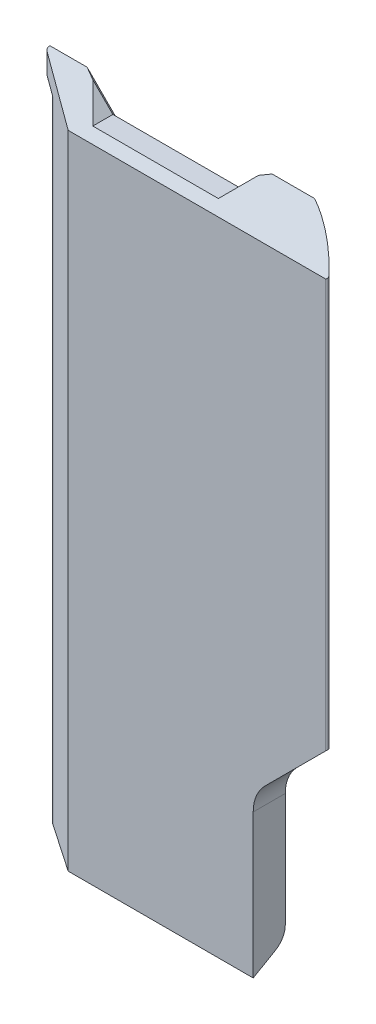
ISO-10303-21;
HEADER;
FILE_DESCRIPTION(('STEP AP214'),'2;1');
FILE_NAME('part.step','',(''),(''),'','','');
FILE_SCHEMA(('AUTOMOTIVE_DESIGN { 1 0 10303 214 1 1 1 1 }'));
ENDSEC;
DATA;
#1=APPLICATION_CONTEXT('core data for automotive mechanical design processes');
#2=APPLICATION_PROTOCOL_DEFINITION('international standard','automotive_design',2000,#1);
#3=PRODUCT_CONTEXT('',#1,'mechanical');
#4=PRODUCT('Part','Part','',(#3));
#5=PRODUCT_RELATED_PRODUCT_CATEGORY('part','',(#4));
#6=PRODUCT_DEFINITION_FORMATION('','',#4);
#7=PRODUCT_DEFINITION_CONTEXT('part definition',#1,'design');
#8=PRODUCT_DEFINITION('design','',#6,#7);
#9=PRODUCT_DEFINITION_SHAPE('','',#8);
#10=(LENGTH_UNIT() NAMED_UNIT(*) SI_UNIT(.MILLI.,.METRE.));
#11=(NAMED_UNIT(*) PLANE_ANGLE_UNIT() SI_UNIT($,.RADIAN.));
#12=(NAMED_UNIT(*) SI_UNIT($,.STERADIAN.) SOLID_ANGLE_UNIT());
#13=UNCERTAINTY_MEASURE_WITH_UNIT(LENGTH_MEASURE(1.E-05),#10,'distance_accuracy_value','');
#14=(GEOMETRIC_REPRESENTATION_CONTEXT(3) GLOBAL_UNCERTAINTY_ASSIGNED_CONTEXT((#13)) GLOBAL_UNIT_ASSIGNED_CONTEXT((#10,
#11,#12)) REPRESENTATION_CONTEXT('',''));
#15=CARTESIAN_POINT('',(0.,0.,0.));
#16=DIRECTION('',(0.,0.,1.));
#17=DIRECTION('',(1.,0.,0.));
#18=AXIS2_PLACEMENT_3D('',#15,#16,#17);
#19=CARTESIAN_POINT('',(-12.4999999999999,0.,21.6506350946109));
#20=DIRECTION('',(-0.499999999999998,0.,0.86602540378444));
#21=DIRECTION('',(0.86602540378444,0.,0.499999999999998));
#22=AXIS2_PLACEMENT_3D('',#19,#20,#21);
#23=PLANE('',#22);
#24=DIRECTION('',(-0.774596669241484,0.447213595499958,-0.447213595499956));
#25=VECTOR('',#24,1.);
#26=CARTESIAN_POINT('',(9.09845356715727,49.8794919243113,34.1205080756887));
#27=LINE('',#26,#25);
#28=CARTESIAN_POINT('',(-36.1435935394489,76.,8.));
#29=VERTEX_POINT('',#28);
#30=CARTESIAN_POINT('',(-48.7071796769725,83.2535898384863,0.746410161513777));
#31=VERTEX_POINT('',#30);
#32=EDGE_CURVE('E302',#29,#31,#27,.T.);
#33=ORIENTED_EDGE('',*,*,#32,.T.);
#34=DIRECTION('',(0.,-1.,0.));
#35=VECTOR('',#34,1.);
#36=CARTESIAN_POINT('',(-48.7071796769725,0.,0.746410161513777));
#37=LINE('',#36,#35);
#38=CARTESIAN_POINT('',(-48.7071796769725,78.1656854249492,0.746410161513777));
#39=VERTEX_POINT('',#38);
#40=EDGE_CURVE('E410',#31,#39,#37,.T.);
#41=ORIENTED_EDGE('',*,*,#40,.T.);
#42=DIRECTION('',(0.774596669241485,-0.447213595499957,0.447213595499956));
#43=VECTOR('',#42,1.);
#44=CARTESIAN_POINT('',(7.33595177749724,45.8091683934817,33.1029271929813));
#45=LINE('',#44,#43);
#46=CARTESIAN_POINT('',(-45.2430780618347,76.1656854249492,2.74641016151378));
#47=VERTEX_POINT('',#46);
#48=EDGE_CURVE('E408',#39,#47,#45,.T.);
#49=ORIENTED_EDGE('',*,*,#48,.T.);
#50=DIRECTION('',(0.,-1.,0.));
#51=VECTOR('',#50,1.);
#52=CARTESIAN_POINT('',(-45.2430780618347,0.,2.74641016151378));
#53=LINE('',#52,#51);
#54=CARTESIAN_POINT('',(-45.2430780618347,-80.9668384925381,2.74641016151378));
#55=VERTEX_POINT('',#54);
#56=EDGE_CURVE('E406',#47,#55,#53,.T.);
#57=ORIENTED_EDGE('',*,*,#56,.T.);
#58=DIRECTION('',(0.832050294337845,-0.277350098112614,0.480384461415259));
#59=VECTOR('',#58,1.);
#60=CARTESIAN_POINT('',(-33.7033533491883,-84.8134133967535,9.40887333073431));
#61=LINE('',#60,#59);
#62=CARTESIAN_POINT('',(-36.1435935394489,-84.,8.));
#63=VERTEX_POINT('',#62);
#64=EDGE_CURVE('E287',#55,#63,#61,.T.);
#65=ORIENTED_EDGE('',*,*,#64,.T.);
#66=DIRECTION('',(0.,1.,0.));
#67=VECTOR('',#66,1.);
#68=CARTESIAN_POINT('',(-36.1435935394489,0.,8.));
#69=LINE('',#68,#67);
#70=EDGE_CURVE('E295',#63,#29,#69,.T.);
#71=ORIENTED_EDGE('',*,*,#70,.T.);
#72=EDGE_LOOP('',(#33,#41,#49,#57,#65,#71));
#73=FACE_BOUND('',#72,.T.);
#74=ADVANCED_FACE('F39',(#73),#23,.T.);
#75=CARTESIAN_POINT('',(0.,0.,0.));
#76=DIRECTION('',(0.,0.,-1.));
#77=DIRECTION('',(-1.,0.,0.));
#78=AXIS2_PLACEMENT_3D('',#75,#76,#77);
#79=PLANE('',#78);
#80=DIRECTION('',(-1.,0.,0.));
#81=VECTOR('',#80,1.);
#82=CARTESIAN_POINT('',(-50.,78.,0.));
#83=LINE('',#82,#81);
#84=CARTESIAN_POINT('',(-41.8994949366117,78.,0.));
#85=VERTEX_POINT('',#84);
#86=CARTESIAN_POINT('',(-48.5071796769725,78.,0.));
#87=VERTEX_POINT('',#86);
#88=EDGE_CURVE('E374',#85,#87,#83,.T.);
#89=ORIENTED_EDGE('',*,*,#88,.T.);
#90=DIRECTION('',(0.,-1.,0.));
#91=VECTOR('',#90,1.);
#92=CARTESIAN_POINT('',(-48.5071796769725,0.,0.));
#93=LINE('',#92,#91);
#94=CARTESIAN_POINT('',(-48.5071796769725,84.,0.));
#95=VERTEX_POINT('',#94);
#96=EDGE_CURVE('E416',#87,#95,#93,.F.);
#97=ORIENTED_EDGE('',*,*,#96,.T.);
#98=DIRECTION('',(-1.,0.,0.));
#99=VECTOR('',#98,1.);
#100=CARTESIAN_POINT('',(-50.,84.,0.));
#101=LINE('',#100,#99);
#102=CARTESIAN_POINT('',(-39.4142135623731,84.,0.));
#103=VERTEX_POINT('',#102);
#104=EDGE_CURVE('E298',#103,#95,#101,.T.);
#105=ORIENTED_EDGE('',*,*,#104,.F.);
#106=DIRECTION('',(0.707106781186545,-0.70710678118655,0.));
#107=VECTOR('',#106,1.);
#108=CARTESIAN_POINT('',(-32.7071067811866,77.2928932188134,0.));
#109=LINE('',#108,#107);
#110=CARTESIAN_POINT('',(-32.4142135623731,77.,0.));
#111=VERTEX_POINT('',#110);
#112=EDGE_CURVE('E341',#103,#111,#109,.T.);
#113=ORIENTED_EDGE('',*,*,#112,.T.);
#114=DIRECTION('',(1.,0.,0.));
#115=VECTOR('',#114,1.);
#116=CARTESIAN_POINT('',(-0.69326392517994,77.,0.));
#117=LINE('',#116,#115);
#118=CARTESIAN_POINT('',(-0.279050362806846,77.,0.));
#119=VERTEX_POINT('',#118);
#120=EDGE_CURVE('E343',#111,#119,#117,.T.);
#121=ORIENTED_EDGE('',*,*,#120,.T.);
#122=DIRECTION('',(0.707106781186548,0.707106781186547,0.));
#123=VECTOR('',#122,1.);
#124=CARTESIAN_POINT('',(6.01384285600663,83.2928932188134,0.));
#125=LINE('',#124,#123);
#126=CARTESIAN_POINT('',(6.7209496371932,84.,0.));
#127=VERTEX_POINT('',#126);
#128=EDGE_CURVE('E345',#119,#127,#125,.T.);
#129=ORIENTED_EDGE('',*,*,#128,.T.);
#130=CARTESIAN_POINT('',(17.3067360748201,84.,0.));
#131=VERTEX_POINT('',#130);
#132=EDGE_CURVE('E303',#131,#127,#101,.T.);
#133=ORIENTED_EDGE('',*,*,#132,.F.);
#134=DIRECTION('',(0.,-1.,0.));
#135=VECTOR('',#134,1.);
#136=CARTESIAN_POINT('',(17.3067360748201,114.,0.));
#137=LINE('',#136,#135);
#138=CARTESIAN_POINT('',(17.3067360748201,-36.6932639251798,0.));
#139=VERTEX_POINT('',#138);
#140=EDGE_CURVE('E289',#131,#139,#137,.T.);
#141=ORIENTED_EDGE('',*,*,#140,.T.);
#142=DIRECTION('',(0.707106781186544,0.707106781186551,0.));
#143=VECTOR('',#142,1.);
#144=CARTESIAN_POINT('',(60.,6.00000000000048,0.));
#145=LINE('',#144,#143);
#146=CARTESIAN_POINT('',(12.9289321881345,-41.0710678118655,0.));
#147=VERTEX_POINT('',#146);
#148=EDGE_CURVE('E276',#147,#139,#145,.T.);
#149=ORIENTED_EDGE('',*,*,#148,.F.);
#150=CARTESIAN_POINT('',(20.,-48.1421356237309,0.));
#151=DIRECTION('',(0.,0.,-1.));
#152=DIRECTION('',(-1.,0.,0.));
#153=AXIS2_PLACEMENT_3D('',#150,#151,#152);
#154=CIRCLE('',#153,10.);
#155=CARTESIAN_POINT('',(9.99999999999999,-48.1421356237309,0.));
#156=VERTEX_POINT('',#155);
#157=EDGE_CURVE('E326',#147,#156,#154,.F.);
#158=ORIENTED_EDGE('',*,*,#157,.T.);
#159=DIRECTION('',(0.,1.,0.));
#160=VECTOR('',#159,1.);
#161=CARTESIAN_POINT('',(9.99999999999999,-44.,0.));
#162=LINE('',#161,#160);
#163=CARTESIAN_POINT('',(9.99999999999999,-76.4944465005349,0.));
#164=VERTEX_POINT('',#163);
#165=EDGE_CURVE('E269',#164,#156,#162,.T.);
#166=ORIENTED_EDGE('',*,*,#165,.F.);
#167=DIRECTION('',(-1.,0.,0.));
#168=VECTOR('',#167,1.);
#169=CARTESIAN_POINT('',(0.,-76.4944465005349,0.));
#170=LINE('',#169,#168);
#171=CARTESIAN_POINT('',(-34.,-76.4944465005349,0.));
#172=VERTEX_POINT('',#171);
#173=EDGE_CURVE('E311',#164,#172,#170,.T.);
#174=ORIENTED_EDGE('',*,*,#173,.T.);
#175=DIRECTION('',(0.,-1.,0.));
#176=VECTOR('',#175,1.);
#177=CARTESIAN_POINT('',(-34.,0.,0.));
#178=LINE('',#177,#176);
#179=CARTESIAN_POINT('',(-34.,-68.4944465005349,0.));
#180=VERTEX_POINT('',#179);
#181=EDGE_CURVE('E232',#180,#172,#178,.T.);
#182=ORIENTED_EDGE('',*,*,#181,.F.);
#183=DIRECTION('',(1.,0.,0.));
#184=VECTOR('',#183,1.);
#185=CARTESIAN_POINT('',(0.,-68.4944465005349,0.));
#186=LINE('',#185,#184);
#187=CARTESIAN_POINT('',(-1.00000000000008,-68.4944465005349,0.));
#188=VERTEX_POINT('',#187);
#189=EDGE_CURVE('E377',#180,#188,#186,.T.);
#190=ORIENTED_EDGE('',*,*,#189,.T.);
#191=DIRECTION('',(0.,1.,0.));
#192=VECTOR('',#191,1.);
#193=CARTESIAN_POINT('',(-1.00000000000001,-13.801182575355,0.));
#194=LINE('',#193,#192);
#195=CARTESIAN_POINT('',(-1.00000000000001,-14.6296097001012,0.));
#196=VERTEX_POINT('',#195);
#197=EDGE_CURVE('E363',#188,#196,#194,.T.);
#198=ORIENTED_EDGE('',*,*,#197,.T.);
#199=DIRECTION('',(0.707106781186549,0.707106781186546,0.));
#200=VECTOR('',#199,1.);
#201=CARTESIAN_POINT('',(5.72094963719316,-7.90866006290804,0.));
#202=LINE('',#201,#200);
#203=CARTESIAN_POINT('',(6.30673607482006,-7.32287362528113,0.));
#204=VERTEX_POINT('',#203);
#205=EDGE_CURVE('E238',#196,#204,#202,.T.);
#206=ORIENTED_EDGE('',*,*,#205,.T.);
#207=DIRECTION('',(0.,1.,0.));
#208=VECTOR('',#207,1.);
#209=CARTESIAN_POINT('',(6.30673607482007,58.5055534994651,0.));
#210=LINE('',#209,#208);
#211=CARTESIAN_POINT('',(6.30673607482007,59.3339806242113,0.));
#212=VERTEX_POINT('',#211);
#213=EDGE_CURVE('E366',#204,#212,#210,.T.);
#214=ORIENTED_EDGE('',*,*,#213,.T.);
#215=DIRECTION('',(-0.707106781186547,0.707106781186548,0.));
#216=VECTOR('',#215,1.);
#217=CARTESIAN_POINT('',(32.8203583495157,32.8203583495157,0.));
#218=LINE('',#217,#216);
#219=CARTESIAN_POINT('',(-4.86483680043379,70.5055534994652,0.));
#220=VERTEX_POINT('',#219);
#221=EDGE_CURVE('E368',#212,#220,#218,.T.);
#222=ORIENTED_EDGE('',*,*,#221,.T.);
#223=DIRECTION('',(-1.,0.,0.));
#224=VECTOR('',#223,1.);
#225=CARTESIAN_POINT('',(-35.233475560823,70.5055534994652,0.));
#226=LINE('',#225,#224);
#227=CARTESIAN_POINT('',(-34.4050484360768,70.5055534994652,0.));
#228=VERTEX_POINT('',#227);
#229=EDGE_CURVE('E370',#220,#228,#226,.T.);
#230=ORIENTED_EDGE('',*,*,#229,.T.);
#231=DIRECTION('',(-0.707106781186548,0.707106781186548,0.));
#232=VECTOR('',#231,1.);
#233=CARTESIAN_POINT('',(-41.3137084989847,77.4142135623731,0.));
#234=LINE('',#233,#232);
#235=EDGE_CURVE('E372',#228,#85,#234,.T.);
#236=ORIENTED_EDGE('',*,*,#235,.T.);
#237=EDGE_LOOP('',(#89,#97,#105,#113,#121,#129,#133,#141,#149,#158,#166,#174,#182,#190,#198,
#206,#214,#222,#230,#236));
#238=FACE_BOUND('',#237,.T.);
#239=ADVANCED_FACE('F433',(#238),#79,.T.);
#240=CARTESIAN_POINT('',(6.53640646055106,114.,28.));
#241=DIRECTION('',(0.,-1.,0.));
#242=DIRECTION('',(0.,0.,-1.));
#243=AXIS2_PLACEMENT_3D('',#240,#241,#242);
#244=CYLINDRICAL_SURFACE('',#243,30.);
#245=CARTESIAN_POINT('',(6.53640646055106,56.,28.));
#246=DIRECTION('',(0.,0.707106781186546,0.707106781186549));
#247=DIRECTION('',(0.,-0.707106781186549,0.707106781186546));
#248=AXIS2_PLACEMENT_3D('',#245,#246,#247);
#249=ELLIPSE('',#248,42.4264068711929,30.);
#250=CARTESIAN_POINT('',(28.2738496256124,76.6756756756757,7.32432432432432));
#251=VERTEX_POINT('',#250);
#252=EDGE_CURVE('E308',#131,#251,#249,.F.);
#253=ORIENTED_EDGE('',*,*,#252,.T.);
#254=DIRECTION('',(0.,-1.,0.));
#255=VECTOR('',#254,1.);
#256=CARTESIAN_POINT('',(28.2738496256124,114.,7.32432432432432));
#257=LINE('',#256,#255);
#258=CARTESIAN_POINT('',(28.2738496256124,-25.7261503743874,7.32432432432432));
#259=VERTEX_POINT('',#258);
#260=EDGE_CURVE('E382',#251,#259,#257,.T.);
#261=ORIENTED_EDGE('',*,*,#260,.T.);
#262=CARTESIAN_POINT('',(6.53640646055106,-47.463593539449,28.));
#263=DIRECTION('',(-0.707106781186551,0.707106781186544,0.));
#264=DIRECTION('',(-0.707106781186544,-0.707106781186551,0.));
#265=AXIS2_PLACEMENT_3D('',#262,#263,#264);
#266=ELLIPSE('',#265,42.4264068711931,30.);
#267=EDGE_CURVE('E285',#259,#139,#266,.T.);
#268=ORIENTED_EDGE('',*,*,#267,.T.);
#269=ORIENTED_EDGE('',*,*,#140,.F.);
#270=EDGE_LOOP('',(#253,#261,#268,#269));
#271=FACE_BOUND('',#270,.T.);
#272=ADVANCED_FACE('F535',(#271),#244,.T.);
#273=CARTESIAN_POINT('',(0.,0.,8.));
#274=DIRECTION('',(0.,0.,-1.));
#275=DIRECTION('',(-1.,0.,0.));
#276=AXIS2_PLACEMENT_3D('',#273,#274,#275);
#277=PLANE('',#276);
#278=DIRECTION('',(0.707106781186544,0.707106781186551,0.));
#279=VECTOR('',#278,1.);
#280=CARTESIAN_POINT('',(27.0000000000001,-26.9999999999998,8.));
#281=LINE('',#280,#279);
#282=CARTESIAN_POINT('',(12.9289321881345,-41.0710678118655,8.));
#283=VERTEX_POINT('',#282);
#284=CARTESIAN_POINT('',(27.9840170500783,-26.0159829499215,8.));
#285=VERTEX_POINT('',#284);
#286=EDGE_CURVE('E318',#283,#285,#281,.T.);
#287=ORIENTED_EDGE('',*,*,#286,.T.);
#288=DIRECTION('',(0.,-1.,0.));
#289=VECTOR('',#288,1.);
#290=CARTESIAN_POINT('',(27.9840170500783,0.,8.));
#291=LINE('',#290,#289);
#292=CARTESIAN_POINT('',(27.9840170500783,76.,8.));
#293=VERTEX_POINT('',#292);
#294=EDGE_CURVE('E400',#285,#293,#291,.F.);
#295=ORIENTED_EDGE('',*,*,#294,.T.);
#296=DIRECTION('',(1.,0.,0.));
#297=VECTOR('',#296,1.);
#298=CARTESIAN_POINT('',(0.,76.,8.));
#299=LINE('',#298,#297);
#300=EDGE_CURVE('E292',#29,#293,#299,.T.);
#301=ORIENTED_EDGE('',*,*,#300,.F.);
#302=ORIENTED_EDGE('',*,*,#70,.F.);
#303=DIRECTION('',(1.,0.,0.));
#304=VECTOR('',#303,1.);
#305=CARTESIAN_POINT('',(-50.,-84.,8.));
#306=LINE('',#305,#304);
#307=CARTESIAN_POINT('',(9.99999999999999,-84.,8.00000000000004));
#308=VERTEX_POINT('',#307);
#309=EDGE_CURVE('E299',#63,#308,#306,.T.);
#310=ORIENTED_EDGE('',*,*,#309,.T.);
#311=DIRECTION('',(0.,1.,0.));
#312=VECTOR('',#311,1.);
#313=CARTESIAN_POINT('',(10.,0.,8.));
#314=LINE('',#313,#312);
#315=CARTESIAN_POINT('',(9.99999999999999,-48.1421356237309,8.));
#316=VERTEX_POINT('',#315);
#317=EDGE_CURVE('E282',#308,#316,#314,.T.);
#318=ORIENTED_EDGE('',*,*,#317,.T.);
#319=CARTESIAN_POINT('',(20.,-48.1421356237309,8.));
#320=DIRECTION('',(0.,0.,-1.));
#321=DIRECTION('',(-1.,0.,0.));
#322=AXIS2_PLACEMENT_3D('',#319,#320,#321);
#323=CIRCLE('',#322,10.);
#324=EDGE_CURVE('E328',#316,#283,#323,.T.);
#325=ORIENTED_EDGE('',*,*,#324,.T.);
#326=EDGE_LOOP('',(#287,#295,#301,#302,#310,#318,#325));
#327=FACE_BOUND('',#326,.T.);
#328=ADVANCED_FACE('F540',(#327),#277,.F.);
#329=CARTESIAN_POINT('',(0.,41.9999999999999,42.));
#330=DIRECTION('',(0.,0.707106781186546,0.707106781186549));
#331=DIRECTION('',(0.,-0.707106781186549,0.707106781186546));
#332=AXIS2_PLACEMENT_3D('',#329,#330,#331);
#333=PLANE('',#332);
#334=ORIENTED_EDGE('',*,*,#300,.T.);
#335=CARTESIAN_POINT('',(27.9840170500783,76.4,7.6));
#336=DIRECTION('',(0.,0.707106781186546,0.707106781186549));
#337=DIRECTION('',(0.,-0.707106781186549,0.707106781186546));
#338=AXIS2_PLACEMENT_3D('',#335,#336,#337);
#339=ELLIPSE('',#338,0.565685424949239,0.4);
#340=EDGE_CURVE('E404',#293,#251,#339,.T.);
#341=ORIENTED_EDGE('',*,*,#340,.T.);
#342=ORIENTED_EDGE('',*,*,#252,.F.);
#343=ORIENTED_EDGE('',*,*,#132,.T.);
#344=DIRECTION('',(-0.862856209461017,-0.357406744336594,0.357406744336593));
#345=VECTOR('',#344,1.);
#346=CARTESIAN_POINT('',(-24.1877502271688,71.1971973208618,12.8028026791382));
#347=LINE('',#346,#345);
#348=CARTESIAN_POINT('',(4.3067360748201,83.,1.00000000000003));
#349=VERTEX_POINT('',#348);
#350=EDGE_CURVE('E349',#127,#349,#347,.T.);
#351=ORIENTED_EDGE('',*,*,#350,.T.);
#352=DIRECTION('',(0.577350269189627,0.577350269189626,-0.577350269189624));
#353=VECTOR('',#352,1.);
#354=CARTESIAN_POINT('',(-24.46217595012,54.2310879750599,29.76891202494));
#355=LINE('',#354,#353);
#356=CARTESIAN_POINT('',(-0.693263925179946,78.,6.00000000000005));
#357=VERTEX_POINT('',#356);
#358=EDGE_CURVE('E330',#357,#349,#355,.T.);
#359=ORIENTED_EDGE('',*,*,#358,.F.);
#360=DIRECTION('',(1.,0.,0.));
#361=VECTOR('',#360,1.);
#362=CARTESIAN_POINT('',(0.,78.,6.00000000000004));
#363=LINE('',#362,#361);
#364=CARTESIAN_POINT('',(-32.,78.,6.00000000000004));
#365=VERTEX_POINT('',#364);
#366=EDGE_CURVE('E333',#365,#357,#363,.T.);
#367=ORIENTED_EDGE('',*,*,#366,.F.);
#368=DIRECTION('',(0.577350269189624,-0.577350269189628,0.577350269189626));
#369=VECTOR('',#368,1.);
#370=CARTESIAN_POINT('',(2.66666666666655,43.3333333333332,40.6666666666668));
#371=LINE('',#370,#369);
#372=CARTESIAN_POINT('',(-37.,83.,1.00000000000003));
#373=VERTEX_POINT('',#372);
#374=EDGE_CURVE('E336',#373,#365,#371,.T.);
#375=ORIENTED_EDGE('',*,*,#374,.F.);
#376=DIRECTION('',(-0.862856209461016,0.357406744336595,-0.357406744336594));
#377=VECTOR('',#376,1.);
#378=CARTESIAN_POINT('',(15.8353025632353,61.1149011062219,22.8850988937781));
#379=LINE('',#378,#377);
#380=EDGE_CURVE('E347',#373,#103,#379,.T.);
#381=ORIENTED_EDGE('',*,*,#380,.T.);
#382=ORIENTED_EDGE('',*,*,#104,.T.);
#383=CARTESIAN_POINT('',(-48.5071796769725,83.6000000000001,0.400000000000001));
#384=DIRECTION('',(0.,0.707106781186546,0.707106781186549));
#385=DIRECTION('',(0.,-0.707106781186549,0.707106781186546));
#386=AXIS2_PLACEMENT_3D('',#383,#384,#385);
#387=ELLIPSE('',#386,0.565685424949239,0.4);
#388=EDGE_CURVE('E402',#95,#31,#387,.T.);
#389=ORIENTED_EDGE('',*,*,#388,.T.);
#390=ORIENTED_EDGE('',*,*,#32,.F.);
#391=EDGE_LOOP('',(#334,#341,#342,#343,#351,#359,#367,#375,#381,#382,#389,#390));
#392=FACE_BOUND('',#391,.T.);
#393=ADVANCED_FACE('F538',(#392),#333,.T.);
#394=CARTESIAN_POINT('',(0.,-59.5358983848622,-34.3730669589465));
#395=DIRECTION('',(0.,-0.866025403784438,-0.500000000000001));
#396=DIRECTION('',(0.,0.500000000000001,-0.866025403784438));
#397=AXIS2_PLACEMENT_3D('',#394,#395,#396);
#398=PLANE('',#397);
#399=ORIENTED_EDGE('',*,*,#64,.F.);
#400=CARTESIAN_POINT('',(-45.0430780618347,-80.7668384925381,2.4));
#401=DIRECTION('',(0.,-0.866025403784438,-0.500000000000001));
#402=DIRECTION('',(0.,-0.500000000000001,0.866025403784438));
#403=AXIS2_PLACEMENT_3D('',#400,#401,#402);
#404=ELLIPSE('',#403,0.461880215351701,0.4);
#405=CARTESIAN_POINT('',(-45.4303763964554,-80.824573519457,2.5));
#406=VERTEX_POINT('',#405);
#407=EDGE_CURVE('E418',#55,#406,#404,.T.);
#408=ORIENTED_EDGE('',*,*,#407,.T.);
#409=DIRECTION('',(-1.,0.,0.));
#410=VECTOR('',#409,1.);
#411=CARTESIAN_POINT('',(0.,-80.824573519457,2.5));
#412=LINE('',#411,#410);
#413=CARTESIAN_POINT('',(9.99999999999999,-80.824573519457,2.5));
#414=VERTEX_POINT('',#413);
#415=EDGE_CURVE('E314',#406,#414,#412,.F.);
#416=ORIENTED_EDGE('',*,*,#415,.T.);
#417=DIRECTION('',(0.,0.500000000000001,-0.866025403784438));
#418=VECTOR('',#417,1.);
#419=CARTESIAN_POINT('',(9.99999999999999,-59.5358983848622,-34.3730669589465));
#420=LINE('',#419,#418);
#421=EDGE_CURVE('E279',#308,#414,#420,.T.);
#422=ORIENTED_EDGE('',*,*,#421,.F.);
#423=ORIENTED_EDGE('',*,*,#309,.F.);
#424=EDGE_LOOP('',(#399,#408,#416,#422,#423));
#425=FACE_BOUND('',#424,.T.);
#426=ADVANCED_FACE('F432',(#425),#398,.T.);
#427=CARTESIAN_POINT('',(0.,-76.4944465005349,5.));
#428=DIRECTION('',(-1.,0.,0.));
#429=DIRECTION('',(0.,0.,1.));
#430=AXIS2_PLACEMENT_3D('',#427,#428,#429);
#431=CYLINDRICAL_SURFACE('',#430,5.);
#432=ORIENTED_EDGE('',*,*,#415,.F.);
#433=CARTESIAN_POINT('',(-45.4303763964554,-80.824573519457,2.5));
#434=CARTESIAN_POINT('',(-45.4378427211251,-80.807885335445,2.47105946234303));
#435=CARTESIAN_POINT('',(-45.4419723624522,-80.7905322558136,2.44170671072575));
#436=CARTESIAN_POINT('',(-45.4437938797185,-80.7551766158567,2.38326649098226));
#437=CARTESIAN_POINT('',(-45.4414990678816,-80.737175474733,2.35417859940898));
#438=CARTESIAN_POINT('',(-45.4313478450425,-80.7031780215346,2.30046578819398));
#439=CARTESIAN_POINT('',(-45.424153192839,-80.687186383771,2.27570937540224));
#440=CARTESIAN_POINT('',(-45.4050136575968,-80.6556317368514,2.22775216018819));
#441=CARTESIAN_POINT('',(-45.3930639843171,-80.6400691769084,2.20455295413454));
#442=CARTESIAN_POINT('',(-45.3642830206514,-80.6097666032676,2.16012766005666));
#443=CARTESIAN_POINT('',(-45.3473834832801,-80.5950417817653,2.13893504584978));
#444=CARTESIAN_POINT('',(-45.3088881395701,-80.5674880811874,2.09984455742066));
#445=CARTESIAN_POINT('',(-45.2873037212084,-80.5546547291808,2.08193888479921));
#446=CARTESIAN_POINT('',(-45.2475883364507,-80.5356430481617,2.05569995130867));
#447=CARTESIAN_POINT('',(-45.2306381742387,-80.5286611239552,2.04615156556742));
#448=CARTESIAN_POINT('',(-45.1950487665225,-80.5163961896203,2.02947364938593));
#449=CARTESIAN_POINT('',(-45.1764137719415,-80.5111090487987,2.02233823544102));
#450=CARTESIAN_POINT('',(-45.1389826870595,-80.5028344749713,2.01120855683318));
#451=CARTESIAN_POINT('',(-45.1202608817061,-80.4997298263376,2.00705388861777));
#452=CARTESIAN_POINT('',(-45.0820677271006,-80.4955160796758,2.00142601721193));
#453=CARTESIAN_POINT('',(-45.0625919976933,-80.4944213156715,1.99997207409895));
#454=CARTESIAN_POINT('',(-45.0430780618347,-80.4944465005349,2.));
#455=B_SPLINE_CURVE_WITH_KNOTS('',3,(#433,#434,#435,#436,#437,#438,#439,#440,#441,#442,#443,
#444,#445,#446,#447,#448,#449,#450,#451,#452,#453,#454),.UNSPECIFIED.,.F.,.F.,(4,2,2,2,2,2,2,2,
2,2,4),(0.,0.102455341503792,0.204698540696284,0.295321085586523,0.38603515632146,
0.478064100140838,0.569871797127378,0.631640451922278,0.693257392711238,0.751241235259031,
0.809637022044175),.UNSPECIFIED.);
#456=CARTESIAN_POINT('',(-45.0430780618347,-80.4944465005349,2.));
#457=VERTEX_POINT('',#456);
#458=EDGE_CURVE('E64',#406,#457,#455,.T.);
#459=ORIENTED_EDGE('',*,*,#458,.T.);
#460=DIRECTION('',(-1.,0.,0.));
#461=VECTOR('',#460,1.);
#462=CARTESIAN_POINT('',(0.,-80.4944465005349,2.));
#463=LINE('',#462,#461);
#464=CARTESIAN_POINT('',(-34.,-80.4944465005349,2.));
#465=VERTEX_POINT('',#464);
#466=EDGE_CURVE('E355',#457,#465,#463,.F.);
#467=ORIENTED_EDGE('',*,*,#466,.T.);
#468=CARTESIAN_POINT('',(-34.,-76.4944465005349,5.));
#469=DIRECTION('',(1.,0.,0.));
#470=DIRECTION('',(0.,1.,0.));
#471=AXIS2_PLACEMENT_3D('',#468,#469,#470);
#472=CIRCLE('',#471,5.);
#473=EDGE_CURVE('E360',#172,#465,#472,.F.);
#474=ORIENTED_EDGE('',*,*,#473,.F.);
#475=ORIENTED_EDGE('',*,*,#173,.F.);
#476=CARTESIAN_POINT('',(9.99999999999999,-76.4944465005349,5.));
#477=DIRECTION('',(-1.,0.,0.));
#478=DIRECTION('',(0.,-1.,0.));
#479=AXIS2_PLACEMENT_3D('',#476,#477,#478);
#480=CIRCLE('',#479,5.);
#481=EDGE_CURVE('E316',#414,#164,#480,.F.);
#482=ORIENTED_EDGE('',*,*,#481,.F.);
#483=EDGE_LOOP('',(#432,#459,#467,#474,#475,#482));
#484=FACE_BOUND('',#483,.T.);
#485=ADVANCED_FACE('F426',(#484),#431,.T.);
#486=CARTESIAN_POINT('',(60.,6.00000000000048,20.));
#487=DIRECTION('',(-0.707106781186551,0.707106781186544,0.));
#488=DIRECTION('',(-0.707106781186544,-0.707106781186551,0.));
#489=AXIS2_PLACEMENT_3D('',#486,#487,#488);
#490=PLANE('',#489);
#491=ORIENTED_EDGE('',*,*,#267,.F.);
#492=CARTESIAN_POINT('',(27.9840170500783,-26.0159829499215,7.6));
#493=DIRECTION('',(-0.707106781186551,0.707106781186544,0.));
#494=DIRECTION('',(-0.707106781186544,-0.707106781186551,0.));
#495=AXIS2_PLACEMENT_3D('',#492,#493,#494);
#496=ELLIPSE('',#495,0.565685424949241,0.4);
#497=EDGE_CURVE('E398',#259,#285,#496,.F.);
#498=ORIENTED_EDGE('',*,*,#497,.T.);
#499=ORIENTED_EDGE('',*,*,#286,.F.);
#500=DIRECTION('',(0.,0.,-1.));
#501=VECTOR('',#500,1.);
#502=CARTESIAN_POINT('',(12.9289321881345,-41.0710678118655,0.));
#503=LINE('',#502,#501);
#504=EDGE_CURVE('E321',#283,#147,#503,.T.);
#505=ORIENTED_EDGE('',*,*,#504,.T.);
#506=ORIENTED_EDGE('',*,*,#148,.T.);
#507=EDGE_LOOP('',(#491,#498,#499,#505,#506));
#508=FACE_BOUND('',#507,.T.);
#509=ADVANCED_FACE('F431',(#508),#490,.F.);
#510=CARTESIAN_POINT('',(9.99999999999999,-44.,20.));
#511=DIRECTION('',(-1.,0.,0.));
#512=DIRECTION('',(0.,-1.,0.));
#513=AXIS2_PLACEMENT_3D('',#510,#511,#512);
#514=PLANE('',#513);
#515=ORIENTED_EDGE('',*,*,#165,.T.);
#516=DIRECTION('',(0.,0.,-1.));
#517=VECTOR('',#516,1.);
#518=CARTESIAN_POINT('',(9.99999999999999,-48.1421356237309,8.));
#519=LINE('',#518,#517);
#520=EDGE_CURVE('E324',#156,#316,#519,.F.);
#521=ORIENTED_EDGE('',*,*,#520,.T.);
#522=ORIENTED_EDGE('',*,*,#317,.F.);
#523=ORIENTED_EDGE('',*,*,#421,.T.);
#524=ORIENTED_EDGE('',*,*,#481,.T.);
#525=EDGE_LOOP('',(#515,#521,#522,#523,#524));
#526=FACE_BOUND('',#525,.T.);
#527=ADVANCED_FACE('F439',(#526),#514,.F.);
#528=CARTESIAN_POINT('',(20.,-48.1421356237309,20.));
#529=DIRECTION('',(0.,0.,1.));
#530=DIRECTION('',(1.,0.,0.));
#531=AXIS2_PLACEMENT_3D('',#528,#529,#530);
#532=CYLINDRICAL_SURFACE('',#531,10.);
#533=ORIENTED_EDGE('',*,*,#324,.F.);
#534=ORIENTED_EDGE('',*,*,#520,.F.);
#535=ORIENTED_EDGE('',*,*,#157,.F.);
#536=ORIENTED_EDGE('',*,*,#504,.F.);
#537=EDGE_LOOP('',(#533,#534,#535,#536));
#538=FACE_BOUND('',#537,.T.);
#539=ADVANCED_FACE('F435',(#538),#532,.F.);
#540=CARTESIAN_POINT('',(-32.,78.,10.));
#541=DIRECTION('',(-0.70710678118655,-0.707106781186545,0.));
#542=DIRECTION('',(0.707106781186545,-0.70710678118655,0.));
#543=AXIS2_PLACEMENT_3D('',#540,#541,#542);
#544=PLANE('',#543);
#545=DIRECTION('',(0.,0.,-1.));
#546=VECTOR('',#545,1.);
#547=CARTESIAN_POINT('',(-32.,78.,10.));
#548=LINE('',#547,#546);
#549=CARTESIAN_POINT('',(-32.,78.,1.00000000000003));
#550=VERTEX_POINT('',#549);
#551=EDGE_CURVE('E266',#365,#550,#548,.T.);
#552=ORIENTED_EDGE('',*,*,#551,.T.);
#553=DIRECTION('',(-0.707106781186545,0.70710678118655,0.));
#554=VECTOR('',#553,1.);
#555=CARTESIAN_POINT('',(-38.,84.,1.00000000000003));
#556=LINE('',#555,#554);
#557=EDGE_CURVE('E353',#550,#373,#556,.T.);
#558=ORIENTED_EDGE('',*,*,#557,.T.);
#559=ORIENTED_EDGE('',*,*,#374,.T.);
#560=EDGE_LOOP('',(#552,#558,#559));
#561=FACE_BOUND('',#560,.T.);
#562=ADVANCED_FACE('F438',(#561),#544,.F.);
#563=CARTESIAN_POINT('',(-0.69326392517994,78.,10.));
#564=DIRECTION('',(0.,-1.,0.));
#565=DIRECTION('',(0.,0.,-1.));
#566=AXIS2_PLACEMENT_3D('',#563,#564,#565);
#567=PLANE('',#566);
#568=DIRECTION('',(0.,0.,-1.));
#569=VECTOR('',#568,1.);
#570=CARTESIAN_POINT('',(-0.69326392517994,78.,10.));
#571=LINE('',#570,#569);
#572=CARTESIAN_POINT('',(-0.69326392517994,78.,1.00000000000003));
#573=VERTEX_POINT('',#572);
#574=EDGE_CURVE('E270',#357,#573,#571,.T.);
#575=ORIENTED_EDGE('',*,*,#574,.T.);
#576=DIRECTION('',(-1.,0.,0.));
#577=VECTOR('',#576,1.);
#578=CARTESIAN_POINT('',(-32.,78.,1.00000000000003));
#579=LINE('',#578,#577);
#580=EDGE_CURVE('E351',#573,#550,#579,.T.);
#581=ORIENTED_EDGE('',*,*,#580,.T.);
#582=ORIENTED_EDGE('',*,*,#551,.F.);
#583=ORIENTED_EDGE('',*,*,#366,.T.);
#584=EDGE_LOOP('',(#575,#581,#582,#583));
#585=FACE_BOUND('',#584,.T.);
#586=ADVANCED_FACE('F569',(#585),#567,.F.);
#587=CARTESIAN_POINT('',(5.30673607482007,84.,10.));
#588=DIRECTION('',(0.707106781186547,-0.707106781186548,0.));
#589=DIRECTION('',(0.707106781186548,0.707106781186547,0.));
#590=AXIS2_PLACEMENT_3D('',#587,#588,#589);
#591=PLANE('',#590);
#592=ORIENTED_EDGE('',*,*,#358,.T.);
#593=DIRECTION('',(-0.707106781186548,-0.707106781186547,0.));
#594=VECTOR('',#593,1.);
#595=CARTESIAN_POINT('',(-0.69326392517994,78.,1.00000000000003));
#596=LINE('',#595,#594);
#597=EDGE_CURVE('E338',#349,#573,#596,.T.);
#598=ORIENTED_EDGE('',*,*,#597,.T.);
#599=ORIENTED_EDGE('',*,*,#574,.F.);
#600=EDGE_LOOP('',(#592,#598,#599));
#601=FACE_BOUND('',#600,.T.);
#602=ADVANCED_FACE('F463',(#601),#591,.F.);
#603=CARTESIAN_POINT('',(-32.,78.,1.00000000000003));
#604=DIRECTION('',(0.500000000000002,0.499999999999998,-0.707106781186548));
#605=DIRECTION('',(0.707106781186545,-0.70710678118655,0.));
#606=AXIS2_PLACEMENT_3D('',#603,#604,#605);
#607=PLANE('',#606);
#608=ORIENTED_EDGE('',*,*,#380,.F.);
#609=ORIENTED_EDGE('',*,*,#557,.F.);
#610=DIRECTION('',(-0.281084637714811,-0.678598344545854,-0.678598344545844));
#611=VECTOR('',#610,1.);
#612=CARTESIAN_POINT('',(-29.5264994399321,83.9715585986538,6.97155859865374));
#613=LINE('',#612,#611);
#614=EDGE_CURVE('E273',#111,#550,#613,.F.);
#615=ORIENTED_EDGE('',*,*,#614,.F.);
#616=ORIENTED_EDGE('',*,*,#112,.F.);
#617=EDGE_LOOP('',(#608,#609,#615,#616));
#618=FACE_BOUND('',#617,.T.);
#619=ADVANCED_FACE('F457',(#618),#607,.T.);
#620=CARTESIAN_POINT('',(-0.69326392517994,78.,1.00000000000003));
#621=DIRECTION('',(0.,0.707106781186543,-0.707106781186552));
#622=DIRECTION('',(1.,0.,0.));
#623=AXIS2_PLACEMENT_3D('',#620,#621,#622);
#624=PLANE('',#623);
#625=ORIENTED_EDGE('',*,*,#614,.T.);
#626=ORIENTED_EDGE('',*,*,#580,.F.);
#627=DIRECTION('',(0.281084637714807,-0.678598344545855,-0.678598344545845));
#628=VECTOR('',#627,1.);
#629=CARTESIAN_POINT('',(-1.36367390280759,79.618512860339,2.61851286033902));
#630=LINE('',#629,#628);
#631=EDGE_CURVE('E263',#119,#573,#630,.F.);
#632=ORIENTED_EDGE('',*,*,#631,.F.);
#633=ORIENTED_EDGE('',*,*,#120,.F.);
#634=EDGE_LOOP('',(#625,#626,#632,#633));
#635=FACE_BOUND('',#634,.T.);
#636=ADVANCED_FACE('F450',(#635),#624,.T.);
#637=CARTESIAN_POINT('',(5.30673607482007,84.,1.00000000000003));
#638=DIRECTION('',(-0.500000000000001,0.500000000000001,-0.707106781186546));
#639=DIRECTION('',(0.707106781186548,0.707106781186547,0.));
#640=AXIS2_PLACEMENT_3D('',#637,#638,#639);
#641=PLANE('',#640);
#642=ORIENTED_EDGE('',*,*,#350,.F.);
#643=ORIENTED_EDGE('',*,*,#128,.F.);
#644=ORIENTED_EDGE('',*,*,#631,.T.);
#645=ORIENTED_EDGE('',*,*,#597,.F.);
#646=EDGE_LOOP('',(#642,#643,#644,#645));
#647=FACE_BOUND('',#646,.T.);
#648=ADVANCED_FACE('F442',(#647),#641,.T.);
#649=CARTESIAN_POINT('',(-34.,0.,2.));
#650=DIRECTION('',(1.,0.,0.));
#651=DIRECTION('',(0.,1.,0.));
#652=AXIS2_PLACEMENT_3D('',#649,#650,#651);
#653=PLANE('',#652);
#654=DIRECTION('',(0.,-1.,0.));
#655=VECTOR('',#654,1.);
#656=CARTESIAN_POINT('',(-34.,0.,2.));
#657=LINE('',#656,#655);
#658=CARTESIAN_POINT('',(-34.,-66.4944465005349,2.));
#659=VERTEX_POINT('',#658);
#660=EDGE_CURVE('E248',#659,#465,#657,.T.);
#661=ORIENTED_EDGE('',*,*,#660,.F.);
#662=DIRECTION('',(0.,0.707106781186548,0.707106781186547));
#663=VECTOR('',#662,1.);
#664=CARTESIAN_POINT('',(-34.,-68.4944465005349,0.));
#665=LINE('',#664,#663);
#666=EDGE_CURVE('E380',#659,#180,#665,.F.);
#667=ORIENTED_EDGE('',*,*,#666,.T.);
#668=ORIENTED_EDGE('',*,*,#181,.T.);
#669=ORIENTED_EDGE('',*,*,#473,.T.);
#670=EDGE_LOOP('',(#661,#667,#668,#669));
#671=FACE_BOUND('',#670,.T.);
#672=ADVANCED_FACE('F449',(#671),#653,.F.);
#673=CARTESIAN_POINT('',(0.,0.,2.));
#674=DIRECTION('',(0.,0.,-1.));
#675=DIRECTION('',(-1.,0.,0.));
#676=AXIS2_PLACEMENT_3D('',#673,#674,#675);
#677=PLANE('',#676);
#678=ORIENTED_EDGE('',*,*,#466,.F.);
#679=DIRECTION('',(0.,-1.,0.));
#680=VECTOR('',#679,1.);
#681=CARTESIAN_POINT('',(-45.0430780618347,0.,2.));
#682=LINE('',#681,#680);
#683=CARTESIAN_POINT('',(-45.0430780618347,76.,2.));
#684=VERTEX_POINT('',#683);
#685=EDGE_CURVE('E49',#457,#684,#682,.F.);
#686=ORIENTED_EDGE('',*,*,#685,.T.);
#687=DIRECTION('',(1.,0.,0.));
#688=VECTOR('',#687,1.);
#689=CARTESIAN_POINT('',(0.,76.,2.));
#690=LINE('',#689,#688);
#691=CARTESIAN_POINT('',(-42.7279220613578,76.,2.));
#692=VERTEX_POINT('',#691);
#693=EDGE_CURVE('E253',#684,#692,#690,.T.);
#694=ORIENTED_EDGE('',*,*,#693,.T.);
#695=DIRECTION('',(0.707106781186548,-0.707106781186548,0.));
#696=VECTOR('',#695,1.);
#697=CARTESIAN_POINT('',(16.6360389693211,16.6360389693211,2.));
#698=LINE('',#697,#696);
#699=CARTESIAN_POINT('',(-35.233475560823,68.5055534994652,2.));
#700=VERTEX_POINT('',#699);
#701=EDGE_CURVE('E255',#692,#700,#698,.T.);
#702=ORIENTED_EDGE('',*,*,#701,.T.);
#703=DIRECTION('',(1.,0.,0.));
#704=VECTOR('',#703,1.);
#705=CARTESIAN_POINT('',(0.,68.5055534994652,2.));
#706=LINE('',#705,#704);
#707=CARTESIAN_POINT('',(-5.69326392518,68.5055534994652,2.));
#708=VERTEX_POINT('',#707);
#709=EDGE_CURVE('E257',#700,#708,#706,.T.);
#710=ORIENTED_EDGE('',*,*,#709,.T.);
#711=DIRECTION('',(-0.707106781186547,0.707106781186548,0.));
#712=VECTOR('',#711,1.);
#713=CARTESIAN_POINT('',(31.4061447871426,31.4061447871425,2.));
#714=LINE('',#713,#712);
#715=CARTESIAN_POINT('',(4.30673607482007,58.5055534994651,2.));
#716=VERTEX_POINT('',#715);
#717=EDGE_CURVE('E259',#716,#708,#714,.T.);
#718=ORIENTED_EDGE('',*,*,#717,.F.);
#719=DIRECTION('',(0.,-1.,0.));
#720=VECTOR('',#719,1.);
#721=CARTESIAN_POINT('',(4.30673607482006,0.,2.));
#722=LINE('',#721,#720);
#723=CARTESIAN_POINT('',(4.30673607482006,-6.49444650053493,2.));
#724=VERTEX_POINT('',#723);
#725=EDGE_CURVE('E228',#716,#724,#722,.T.);
#726=ORIENTED_EDGE('',*,*,#725,.T.);
#727=DIRECTION('',(-0.707106781186549,-0.707106781186546,0.));
#728=VECTOR('',#727,1.);
#729=CARTESIAN_POINT('',(5.40059128767749,-5.40059128767751,2.));
#730=LINE('',#729,#728);
#731=CARTESIAN_POINT('',(-3.00000000000001,-13.801182575355,2.));
#732=VERTEX_POINT('',#731);
#733=EDGE_CURVE('E221',#724,#732,#730,.T.);
#734=ORIENTED_EDGE('',*,*,#733,.T.);
#735=DIRECTION('',(0.,-1.,0.));
#736=VECTOR('',#735,1.);
#737=CARTESIAN_POINT('',(-2.99999999999999,0.,2.));
#738=LINE('',#737,#736);
#739=CARTESIAN_POINT('',(-3.00000000000002,-66.4944465005349,2.));
#740=VERTEX_POINT('',#739);
#741=EDGE_CURVE('E225',#732,#740,#738,.T.);
#742=ORIENTED_EDGE('',*,*,#741,.T.);
#743=DIRECTION('',(1.,0.,0.));
#744=VECTOR('',#743,1.);
#745=CARTESIAN_POINT('',(0.,-66.4944465005349,2.));
#746=LINE('',#745,#744);
#747=EDGE_CURVE('E246',#659,#740,#746,.T.);
#748=ORIENTED_EDGE('',*,*,#747,.F.);
#749=ORIENTED_EDGE('',*,*,#660,.T.);
#750=EDGE_LOOP('',(#678,#686,#694,#702,#710,#718,#726,#734,#742,#748,#749));
#751=FACE_BOUND('',#750,.T.);
#752=ADVANCED_FACE('F223',(#751),#677,.T.);
#753=CARTESIAN_POINT('',(0.,76.,2.));
#754=DIRECTION('',(0.,-0.707106781186547,-0.707106781186548));
#755=DIRECTION('',(-1.,0.,0.));
#756=AXIS2_PLACEMENT_3D('',#753,#754,#755);
#757=PLANE('',#756);
#758=DIRECTION('',(0.774596669241485,-0.447213595499957,0.447213595499956));
#759=VECTOR('',#758,1.);
#760=CARTESIAN_POINT('',(-18.0984001745221,60.326325681007,17.673674318993));
#761=LINE('',#760,#759);
#762=CARTESIAN_POINT('',(-45.1944648534492,75.970245917365,2.02975408263498));
#763=VERTEX_POINT('',#762);
#764=CARTESIAN_POINT('',(-48.658566468587,77.970245917365,0.0297540826349856));
#765=VERTEX_POINT('',#764);
#766=EDGE_CURVE('E57',#763,#765,#761,.F.);
#767=ORIENTED_EDGE('',*,*,#766,.T.);
#768=CARTESIAN_POINT('',(-48.5071796769725,77.6,0.400000000000001));
#769=DIRECTION('',(0.,-0.707106781186547,-0.707106781186548));
#770=DIRECTION('',(0.,-0.707106781186548,0.707106781186547));
#771=AXIS2_PLACEMENT_3D('',#768,#769,#770);
#772=ELLIPSE('',#771,0.565685424949238,0.4);
#773=EDGE_CURVE('E414',#765,#87,#772,.T.);
#774=ORIENTED_EDGE('',*,*,#773,.T.);
#775=ORIENTED_EDGE('',*,*,#88,.F.);
#776=DIRECTION('',(0.281084637714821,0.678598344545847,-0.678598344545847));
#777=VECTOR('',#776,1.);
#778=CARTESIAN_POINT('',(-39.3520498881382,84.1500763854248,-6.15007638542476));
#779=LINE('',#778,#777);
#780=EDGE_CURVE('E265',#692,#85,#779,.T.);
#781=ORIENTED_EDGE('',*,*,#780,.F.);
#782=ORIENTED_EDGE('',*,*,#693,.F.);
#783=CARTESIAN_POINT('',(-45.0430780618347,75.6,2.4));
#784=DIRECTION('',(0.,-0.707106781186547,-0.707106781186548));
#785=DIRECTION('',(0.,-0.707106781186548,0.707106781186547));
#786=AXIS2_PLACEMENT_3D('',#783,#784,#785);
#787=ELLIPSE('',#786,0.565685424949238,0.4);
#788=EDGE_CURVE('E11',#684,#763,#787,.F.);
#789=ORIENTED_EDGE('',*,*,#788,.T.);
#790=EDGE_LOOP('',(#767,#774,#775,#781,#782,#789));
#791=FACE_BOUND('',#790,.T.);
#792=ADVANCED_FACE('F510',(#791),#757,.T.);
#793=CARTESIAN_POINT('',(16.6360389693211,16.6360389693211,2.));
#794=DIRECTION('',(-0.5,-0.5,-0.707106781186548));
#795=DIRECTION('',(-0.707106781186548,0.707106781186548,0.));
#796=AXIS2_PLACEMENT_3D('',#793,#794,#795);
#797=PLANE('',#796);
#798=ORIENTED_EDGE('',*,*,#780,.T.);
#799=ORIENTED_EDGE('',*,*,#235,.F.);
#800=DIRECTION('',(0.281084637714821,0.678598344545847,-0.678598344545847));
#801=VECTOR('',#800,1.);
#802=CARTESIAN_POINT('',(-32.4497289152269,75.2261124054738,-4.72055890600869));
#803=LINE('',#802,#801);
#804=EDGE_CURVE('E391',#700,#228,#803,.T.);
#805=ORIENTED_EDGE('',*,*,#804,.F.);
#806=ORIENTED_EDGE('',*,*,#701,.F.);
#807=EDGE_LOOP('',(#798,#799,#805,#806));
#808=FACE_BOUND('',#807,.T.);
#809=ADVANCED_FACE('F504',(#808),#797,.T.);
#810=CARTESIAN_POINT('',(0.,68.5055534994652,2.));
#811=DIRECTION('',(0.,-0.707106781186547,-0.707106781186548));
#812=DIRECTION('',(-1.,0.,0.));
#813=AXIS2_PLACEMENT_3D('',#810,#811,#812);
#814=PLANE('',#813);
#815=ORIENTED_EDGE('',*,*,#804,.T.);
#816=ORIENTED_EDGE('',*,*,#229,.F.);
#817=DIRECTION('',(-0.281084637714823,-0.678598344545847,0.678598344545846));
#818=VECTOR('',#817,1.);
#819=CARTESIAN_POINT('',(-5.24344726355506,69.5915069845415,0.91404651492369));
#820=LINE('',#819,#818);
#821=EDGE_CURVE('E388',#708,#220,#820,.F.);
#822=ORIENTED_EDGE('',*,*,#821,.F.);
#823=ORIENTED_EDGE('',*,*,#709,.F.);
#824=EDGE_LOOP('',(#815,#816,#822,#823));
#825=FACE_BOUND('',#824,.T.);
#826=ADVANCED_FACE('F497',(#825),#814,.T.);
#827=CARTESIAN_POINT('',(32.8203583495157,32.8203583495157,0.));
#828=DIRECTION('',(0.499999999999999,0.499999999999999,0.707106781186549));
#829=DIRECTION('',(-0.707106781186547,0.707106781186548,0.));
#830=AXIS2_PLACEMENT_3D('',#827,#828,#829);
#831=PLANE('',#830);
#832=ORIENTED_EDGE('',*,*,#821,.T.);
#833=ORIENTED_EDGE('',*,*,#221,.F.);
#834=DIRECTION('',(-0.678598344545847,-0.281084637714823,0.678598344545846));
#835=VECTOR('',#834,1.);
#836=CARTESIAN_POINT('',(13.4588425124472,62.2964801102124,-7.1521064376271));
#837=LINE('',#836,#835);
#838=EDGE_CURVE('E385',#716,#212,#837,.F.);
#839=ORIENTED_EDGE('',*,*,#838,.F.);
#840=ORIENTED_EDGE('',*,*,#717,.T.);
#841=EDGE_LOOP('',(#832,#833,#839,#840));
#842=FACE_BOUND('',#841,.T.);
#843=ADVANCED_FACE('F490',(#842),#831,.F.);
#844=CARTESIAN_POINT('',(4.30673607482006,0.,2.));
#845=DIRECTION('',(-0.707106781186547,0.,-0.707106781186548));
#846=DIRECTION('',(0.,1.,0.));
#847=AXIS2_PLACEMENT_3D('',#844,#845,#846);
#848=PLANE('',#847);
#849=ORIENTED_EDGE('',*,*,#838,.T.);
#850=ORIENTED_EDGE('',*,*,#213,.F.);
#851=DIRECTION('',(0.678598344545847,-0.281084637714822,-0.678598344545846));
#852=VECTOR('',#851,1.);
#853=CARTESIAN_POINT('',(3.06796216523452,-5.98132954647066,3.23877390958554));
#854=LINE('',#853,#852);
#855=EDGE_CURVE('E241',#724,#204,#854,.T.);
#856=ORIENTED_EDGE('',*,*,#855,.F.);
#857=ORIENTED_EDGE('',*,*,#725,.F.);
#858=EDGE_LOOP('',(#849,#850,#856,#857));
#859=FACE_BOUND('',#858,.T.);
#860=ADVANCED_FACE('F484',(#859),#848,.T.);
#861=CARTESIAN_POINT('',(5.40059128767749,-5.40059128767751,2.));
#862=DIRECTION('',(-0.499999999999999,0.5,-0.707106781186548));
#863=DIRECTION('',(0.707106781186549,0.707106781186546,0.));
#864=AXIS2_PLACEMENT_3D('',#861,#862,#863);
#865=PLANE('',#864);
#866=ORIENTED_EDGE('',*,*,#855,.T.);
#867=ORIENTED_EDGE('',*,*,#205,.F.);
#868=DIRECTION('',(0.678598344545847,-0.281084637714823,-0.678598344545847));
#869=VECTOR('',#868,1.);
#870=CARTESIAN_POINT('',(-5.63248683230636,-12.7107708266451,4.63248683230635));
#871=LINE('',#870,#869);
#872=EDGE_CURVE('E236',#732,#196,#871,.T.);
#873=ORIENTED_EDGE('',*,*,#872,.F.);
#874=ORIENTED_EDGE('',*,*,#733,.F.);
#875=EDGE_LOOP('',(#866,#867,#873,#874));
#876=FACE_BOUND('',#875,.T.);
#877=ADVANCED_FACE('F237',(#876),#865,.T.);
#878=CARTESIAN_POINT('',(-2.99999999999999,0.,2.));
#879=DIRECTION('',(-0.707106781186547,0.,-0.707106781186548));
#880=DIRECTION('',(0.,1.,0.));
#881=AXIS2_PLACEMENT_3D('',#878,#879,#880);
#882=PLANE('',#881);
#883=ORIENTED_EDGE('',*,*,#872,.T.);
#884=ORIENTED_EDGE('',*,*,#197,.F.);
#885=DIRECTION('',(0.577350269189625,-0.577350269189626,-0.577350269189626));
#886=VECTOR('',#885,1.);
#887=CARTESIAN_POINT('',(-0.66666666666673,-68.8277798338682,-0.333333333333349));
#888=LINE('',#887,#886);
#889=EDGE_CURVE('E242',#740,#188,#888,.T.);
#890=ORIENTED_EDGE('',*,*,#889,.F.);
#891=ORIENTED_EDGE('',*,*,#741,.F.);
#892=EDGE_LOOP('',(#883,#884,#890,#891));
#893=FACE_BOUND('',#892,.T.);
#894=ADVANCED_FACE('F245',(#893),#882,.T.);
#895=CARTESIAN_POINT('',(0.,-68.4944465005349,0.));
#896=DIRECTION('',(0.,-0.707106781186547,0.707106781186548));
#897=DIRECTION('',(1.,0.,0.));
#898=AXIS2_PLACEMENT_3D('',#895,#896,#897);
#899=PLANE('',#898);
#900=ORIENTED_EDGE('',*,*,#666,.F.);
#901=ORIENTED_EDGE('',*,*,#747,.T.);
#902=ORIENTED_EDGE('',*,*,#889,.T.);
#903=ORIENTED_EDGE('',*,*,#189,.F.);
#904=EDGE_LOOP('',(#900,#901,#902,#903));
#905=FACE_BOUND('',#904,.T.);
#906=ADVANCED_FACE('F466',(#905),#899,.F.);
#907=CARTESIAN_POINT('',(27.9840170500783,114.,7.6));
#908=DIRECTION('',(0.,-1.,0.));
#909=DIRECTION('',(0.,0.,-1.));
#910=AXIS2_PLACEMENT_3D('',#907,#908,#909);
#911=CYLINDRICAL_SURFACE('',#910,0.4);
#912=ORIENTED_EDGE('',*,*,#340,.F.);
#913=ORIENTED_EDGE('',*,*,#294,.F.);
#914=ORIENTED_EDGE('',*,*,#497,.F.);
#915=ORIENTED_EDGE('',*,*,#260,.F.);
#916=EDGE_LOOP('',(#912,#913,#914,#915));
#917=FACE_BOUND('',#916,.T.);
#918=ADVANCED_FACE('F472',(#917),#911,.T.);
#919=CARTESIAN_POINT('',(-45.0430780618347,0.,2.4));
#920=DIRECTION('',(0.,-1.,0.));
#921=DIRECTION('',(0.,0.,-1.));
#922=AXIS2_PLACEMENT_3D('',#919,#920,#921);
#923=CYLINDRICAL_SURFACE('',#922,0.4);
#924=ORIENTED_EDGE('',*,*,#407,.F.);
#925=ORIENTED_EDGE('',*,*,#56,.F.);
#926=CARTESIAN_POINT('',(-45.0430780618347,76.1656854249492,2.4));
#927=DIRECTION('',(0.455296498655016,-0.85065080835204,0.262865556059566));
#928=DIRECTION('',(0.736685209782635,0.525731112119134,0.425325404176018));
#929=AXIS2_PLACEMENT_3D('',#926,#927,#928);
#930=ELLIPSE('',#929,0.470228201833979,0.4);
#931=EDGE_CURVE('E44',#763,#47,#930,.F.);
#932=ORIENTED_EDGE('',*,*,#931,.F.);
#933=ORIENTED_EDGE('',*,*,#788,.F.);
#934=ORIENTED_EDGE('',*,*,#685,.F.);
#935=ORIENTED_EDGE('',*,*,#458,.F.);
#936=EDGE_LOOP('',(#924,#925,#932,#933,#934,#935));
#937=FACE_BOUND('',#936,.T.);
#938=ADVANCED_FACE('F41',(#937),#923,.T.);
#939=CARTESIAN_POINT('',(7.53595177749723,45.8091683934817,32.7565170314675));
#940=DIRECTION('',(0.774596669241485,-0.447213595499957,0.447213595499956));
#941=DIRECTION('',(0.499999999999998,0.86602540378444,0.));
#942=AXIS2_PLACEMENT_3D('',#939,#940,#941);
#943=CYLINDRICAL_SURFACE('',#942,0.4);
#944=ORIENTED_EDGE('',*,*,#931,.T.);
#945=ORIENTED_EDGE('',*,*,#48,.F.);
#946=CARTESIAN_POINT('',(-48.5071796769725,78.1656854249492,0.400000000000003));
#947=DIRECTION('',(0.455296498655016,-0.85065080835204,0.262865556059566));
#948=DIRECTION('',(0.736685209782635,0.525731112119134,0.425325404176018));
#949=AXIS2_PLACEMENT_3D('',#946,#947,#948);
#950=ELLIPSE('',#949,0.470228201833979,0.4);
#951=EDGE_CURVE('E585',#765,#39,#950,.F.);
#952=ORIENTED_EDGE('',*,*,#951,.F.);
#953=ORIENTED_EDGE('',*,*,#766,.F.);
#954=EDGE_LOOP('',(#944,#945,#952,#953));
#955=FACE_BOUND('',#954,.T.);
#956=ADVANCED_FACE('F522',(#955),#943,.T.);
#957=CARTESIAN_POINT('',(-48.5071796769725,0.,0.400000000000001));
#958=DIRECTION('',(0.,-1.,0.));
#959=DIRECTION('',(0.,0.,-1.));
#960=AXIS2_PLACEMENT_3D('',#957,#958,#959);
#961=CYLINDRICAL_SURFACE('',#960,0.4);
#962=ORIENTED_EDGE('',*,*,#388,.F.);
#963=ORIENTED_EDGE('',*,*,#96,.F.);
#964=ORIENTED_EDGE('',*,*,#773,.F.);
#965=ORIENTED_EDGE('',*,*,#951,.T.);
#966=ORIENTED_EDGE('',*,*,#40,.F.);
#967=EDGE_LOOP('',(#962,#963,#964,#965,#966));
#968=FACE_BOUND('',#967,.T.);
#969=ADVANCED_FACE('F520',(#968),#961,.T.);
#970=CLOSED_SHELL('',(#74,#239,#272,#328,#393,#426,#485,#509,#527,#539,#562,#586,#602,#619,#636,
#648,#672,#752,#792,#809,#826,#843,#860,#877,#894,#906,#918,#938,#956,#969));
#971=MANIFOLD_SOLID_BREP('B2',#970);
#972=ADVANCED_BREP_SHAPE_REPRESENTATION('',(#18,#971),#14);
#973=SHAPE_DEFINITION_REPRESENTATION(#9,#972);
ENDSEC;
END-ISO-10303-21;
